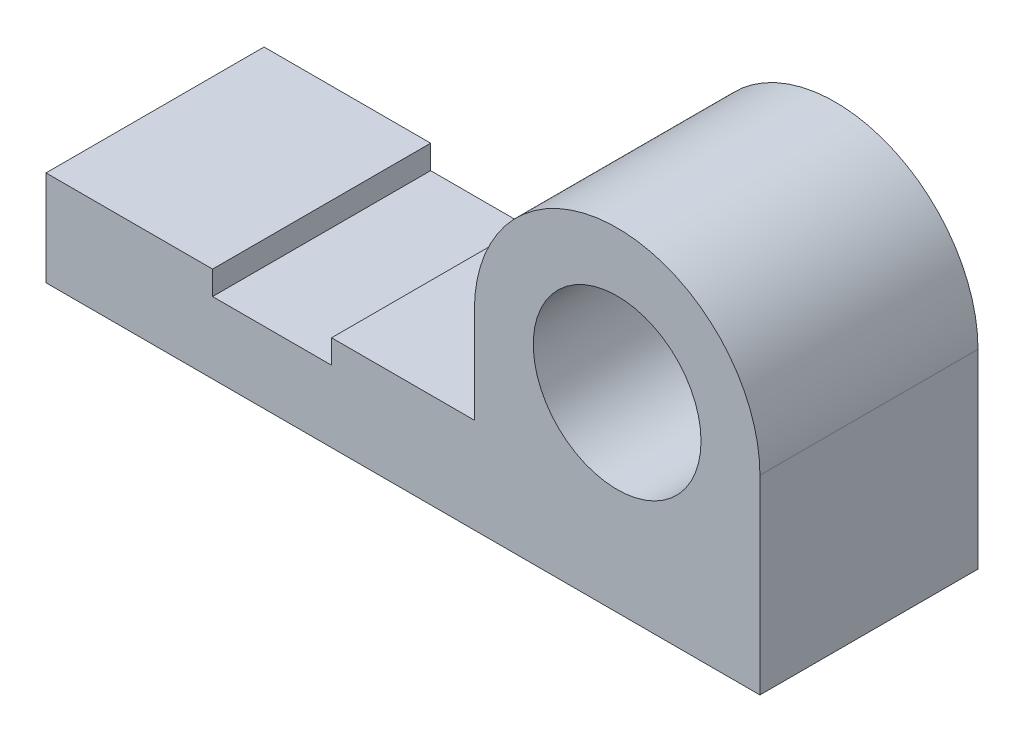
ISO-10303-21;
HEADER;
FILE_DESCRIPTION(('STEP AP214'),'2;1');
FILE_NAME('part.step','',(''),(''),'','','');
FILE_SCHEMA(('AUTOMOTIVE_DESIGN { 1 0 10303 214 1 1 1 1 }'));
ENDSEC;
DATA;
#1=APPLICATION_CONTEXT('core data for automotive mechanical design processes');
#2=APPLICATION_PROTOCOL_DEFINITION('international standard','automotive_design',2000,#1);
#3=PRODUCT_CONTEXT('',#1,'mechanical');
#4=PRODUCT('Part','Part','',(#3));
#5=PRODUCT_RELATED_PRODUCT_CATEGORY('part','',(#4));
#6=PRODUCT_DEFINITION_FORMATION('','',#4);
#7=PRODUCT_DEFINITION_CONTEXT('part definition',#1,'design');
#8=PRODUCT_DEFINITION('design','',#6,#7);
#9=PRODUCT_DEFINITION_SHAPE('','',#8);
#10=(LENGTH_UNIT() NAMED_UNIT(*) SI_UNIT(.MILLI.,.METRE.));
#11=(NAMED_UNIT(*) PLANE_ANGLE_UNIT() SI_UNIT($,.RADIAN.));
#12=(NAMED_UNIT(*) SI_UNIT($,.STERADIAN.) SOLID_ANGLE_UNIT());
#13=UNCERTAINTY_MEASURE_WITH_UNIT(LENGTH_MEASURE(1.E-05),#10,'distance_accuracy_value','');
#14=(GEOMETRIC_REPRESENTATION_CONTEXT(3) GLOBAL_UNCERTAINTY_ASSIGNED_CONTEXT((#13)) GLOBAL_UNIT_ASSIGNED_CONTEXT((#10,
#11,#12)) REPRESENTATION_CONTEXT('',''));
#15=CARTESIAN_POINT('',(0.,0.,0.));
#16=DIRECTION('',(0.,0.,1.));
#17=DIRECTION('',(1.,0.,0.));
#18=AXIS2_PLACEMENT_3D('',#15,#16,#17);
#19=CARTESIAN_POINT('',(-25.5375472920209,34.0500630560278,39.));
#20=DIRECTION('',(0.,0.,1.));
#21=DIRECTION('',(1.,0.,0.));
#22=AXIS2_PLACEMENT_3D('',#19,#20,#21);
#23=PLANE('',#22);
#24=DIRECTION('',(0.,1.,0.));
#25=VECTOR('',#24,1.);
#26=CARTESIAN_POINT('',(0.,0.,39.));
#27=LINE('',#26,#25);
#28=CARTESIAN_POINT('',(0.,0.,39.));
#29=VERTEX_POINT('',#28);
#30=CARTESIAN_POINT('',(0.,34.0500630560278,39.));
#31=VERTEX_POINT('',#30);
#32=EDGE_CURVE('E167',#29,#31,#27,.T.);
#33=ORIENTED_EDGE('',*,*,#32,.T.);
#34=CARTESIAN_POINT('',(-25.5375472920209,34.0500630560278,39.));
#35=DIRECTION('',(0.,0.,1.));
#36=DIRECTION('',(1.,0.,0.));
#37=AXIS2_PLACEMENT_3D('',#34,#35,#36);
#38=CIRCLE('',#37,25.5375472920209);
#39=CARTESIAN_POINT('',(-51.0750945840418,34.0500630560278,39.));
#40=VERTEX_POINT('',#39);
#41=EDGE_CURVE('E103',#31,#40,#38,.T.);
#42=ORIENTED_EDGE('',*,*,#41,.T.);
#43=DIRECTION('',(0.,-1.,0.));
#44=VECTOR('',#43,1.);
#45=CARTESIAN_POINT('',(-51.0750945840418,17.0250315280139,39.));
#46=LINE('',#45,#44);
#47=CARTESIAN_POINT('',(-51.0750945840418,17.0250315280139,39.));
#48=VERTEX_POINT('',#47);
#49=EDGE_CURVE('E187',#40,#48,#46,.T.);
#50=ORIENTED_EDGE('',*,*,#49,.T.);
#51=DIRECTION('',(-1.,0.,0.));
#52=VECTOR('',#51,1.);
#53=CARTESIAN_POINT('',(-76.6126418760627,17.0250315280139,39.));
#54=LINE('',#53,#52);
#55=CARTESIAN_POINT('',(-76.6126418760627,17.0250315280139,39.));
#56=VERTEX_POINT('',#55);
#57=EDGE_CURVE('E207',#48,#56,#54,.T.);
#58=ORIENTED_EDGE('',*,*,#57,.T.);
#59=DIRECTION('',(0.,-1.,0.));
#60=VECTOR('',#59,1.);
#61=CARTESIAN_POINT('',(-76.6126418760627,12.7687736460104,39.));
#62=LINE('',#61,#60);
#63=CARTESIAN_POINT('',(-76.6126418760627,12.7687736460104,39.));
#64=VERTEX_POINT('',#63);
#65=EDGE_CURVE('E204',#56,#64,#62,.T.);
#66=ORIENTED_EDGE('',*,*,#65,.T.);
#67=DIRECTION('',(-1.,0.,0.));
#68=VECTOR('',#67,1.);
#69=CARTESIAN_POINT('',(-97.8939312860801,12.7687736460104,39.));
#70=LINE('',#69,#68);
#71=CARTESIAN_POINT('',(-97.8939312860801,12.7687736460104,39.));
#72=VERTEX_POINT('',#71);
#73=EDGE_CURVE('E206',#64,#72,#70,.T.);
#74=ORIENTED_EDGE('',*,*,#73,.T.);
#75=DIRECTION('',(0.,1.,0.));
#76=VECTOR('',#75,1.);
#77=CARTESIAN_POINT('',(-97.8939312860801,17.0250315280139,39.));
#78=LINE('',#77,#76);
#79=CARTESIAN_POINT('',(-97.8939312860801,17.0250315280139,39.));
#80=VERTEX_POINT('',#79);
#81=EDGE_CURVE('E127',#72,#80,#78,.T.);
#82=ORIENTED_EDGE('',*,*,#81,.T.);
#83=DIRECTION('',(-1.,0.,0.));
#84=VECTOR('',#83,1.);
#85=CARTESIAN_POINT('',(-127.687736460104,17.0250315280139,39.));
#86=LINE('',#85,#84);
#87=CARTESIAN_POINT('',(-127.687736460104,17.0250315280139,39.));
#88=VERTEX_POINT('',#87);
#89=EDGE_CURVE('E125',#80,#88,#86,.T.);
#90=ORIENTED_EDGE('',*,*,#89,.T.);
#91=DIRECTION('',(0.,-1.,0.));
#92=VECTOR('',#91,1.);
#93=CARTESIAN_POINT('',(-127.687736460104,0.,39.));
#94=LINE('',#93,#92);
#95=CARTESIAN_POINT('',(-127.687736460104,0.,39.));
#96=VERTEX_POINT('',#95);
#97=EDGE_CURVE('E126',#88,#96,#94,.T.);
#98=ORIENTED_EDGE('',*,*,#97,.T.);
#99=DIRECTION('',(1.,0.,0.));
#100=VECTOR('',#99,1.);
#101=CARTESIAN_POINT('',(0.,0.,39.));
#102=LINE('',#101,#100);
#103=EDGE_CURVE('E57',#96,#29,#102,.T.);
#104=ORIENTED_EDGE('',*,*,#103,.T.);
#105=EDGE_LOOP('',(#33,#42,#50,#58,#66,#74,#82,#90,#98,#104));
#106=FACE_BOUND('',#105,.T.);
#107=CARTESIAN_POINT('',(-25.5375472920209,34.0500630560278,39.));
#108=DIRECTION('',(0.,0.,1.));
#109=DIRECTION('',(1.,0.,0.));
#110=AXIS2_PLACEMENT_3D('',#107,#108,#109);
#111=CIRCLE('',#110,15.);
#112=CARTESIAN_POINT('',(-10.5375472920209,34.0500630560278,39.));
#113=VERTEX_POINT('',#112);
#114=EDGE_CURVE('E152',#113,#113,#111,.T.);
#115=ORIENTED_EDGE('',*,*,#114,.F.);
#116=EDGE_LOOP('',(#115));
#117=FACE_BOUND('',#116,.T.);
#118=ADVANCED_FACE('F39',(#106,#117),#23,.T.);
#119=CARTESIAN_POINT('',(-25.5375472920209,34.0500630560278,0.));
#120=DIRECTION('',(0.,0.,1.));
#121=DIRECTION('',(1.,0.,0.));
#122=AXIS2_PLACEMENT_3D('',#119,#120,#121);
#123=PLANE('',#122);
#124=DIRECTION('',(0.,1.,0.));
#125=VECTOR('',#124,1.);
#126=CARTESIAN_POINT('',(0.,0.,0.));
#127=LINE('',#126,#125);
#128=CARTESIAN_POINT('',(0.,0.,0.));
#129=VERTEX_POINT('',#128);
#130=CARTESIAN_POINT('',(0.,34.0500630560278,0.));
#131=VERTEX_POINT('',#130);
#132=EDGE_CURVE('E149',#129,#131,#127,.T.);
#133=ORIENTED_EDGE('',*,*,#132,.F.);
#134=DIRECTION('',(1.,0.,0.));
#135=VECTOR('',#134,1.);
#136=CARTESIAN_POINT('',(0.,0.,0.));
#137=LINE('',#136,#135);
#138=CARTESIAN_POINT('',(-127.687736460104,0.,0.));
#139=VERTEX_POINT('',#138);
#140=EDGE_CURVE('E100',#139,#129,#137,.T.);
#141=ORIENTED_EDGE('',*,*,#140,.F.);
#142=DIRECTION('',(0.,-1.,0.));
#143=VECTOR('',#142,1.);
#144=CARTESIAN_POINT('',(-127.687736460104,0.,0.));
#145=LINE('',#144,#143);
#146=CARTESIAN_POINT('',(-127.687736460104,17.0250315280139,0.));
#147=VERTEX_POINT('',#146);
#148=EDGE_CURVE('E91',#147,#139,#145,.T.);
#149=ORIENTED_EDGE('',*,*,#148,.F.);
#150=DIRECTION('',(-1.,0.,0.));
#151=VECTOR('',#150,1.);
#152=CARTESIAN_POINT('',(-127.687736460104,17.0250315280139,0.));
#153=LINE('',#152,#151);
#154=CARTESIAN_POINT('',(-97.8939312860801,17.0250315280139,0.));
#155=VERTEX_POINT('',#154);
#156=EDGE_CURVE('E138',#155,#147,#153,.T.);
#157=ORIENTED_EDGE('',*,*,#156,.F.);
#158=DIRECTION('',(0.,1.,0.));
#159=VECTOR('',#158,1.);
#160=CARTESIAN_POINT('',(-97.8939312860801,17.0250315280139,0.));
#161=LINE('',#160,#159);
#162=CARTESIAN_POINT('',(-97.8939312860801,12.7687736460104,0.));
#163=VERTEX_POINT('',#162);
#164=EDGE_CURVE('E162',#163,#155,#161,.T.);
#165=ORIENTED_EDGE('',*,*,#164,.F.);
#166=DIRECTION('',(-1.,0.,0.));
#167=VECTOR('',#166,1.);
#168=CARTESIAN_POINT('',(-97.8939312860801,12.7687736460104,0.));
#169=LINE('',#168,#167);
#170=CARTESIAN_POINT('',(-76.6126418760627,12.7687736460104,0.));
#171=VERTEX_POINT('',#170);
#172=EDGE_CURVE('E158',#171,#163,#169,.T.);
#173=ORIENTED_EDGE('',*,*,#172,.F.);
#174=DIRECTION('',(0.,-1.,0.));
#175=VECTOR('',#174,1.);
#176=CARTESIAN_POINT('',(-76.6126418760627,12.7687736460104,0.));
#177=LINE('',#176,#175);
#178=CARTESIAN_POINT('',(-76.6126418760627,17.0250315280139,0.));
#179=VERTEX_POINT('',#178);
#180=EDGE_CURVE('E156',#179,#171,#177,.T.);
#181=ORIENTED_EDGE('',*,*,#180,.F.);
#182=DIRECTION('',(-1.,0.,0.));
#183=VECTOR('',#182,1.);
#184=CARTESIAN_POINT('',(-76.6126418760627,17.0250315280139,0.));
#185=LINE('',#184,#183);
#186=CARTESIAN_POINT('',(-51.0750945840418,17.0250315280139,0.));
#187=VERTEX_POINT('',#186);
#188=EDGE_CURVE('E157',#187,#179,#185,.T.);
#189=ORIENTED_EDGE('',*,*,#188,.F.);
#190=DIRECTION('',(0.,-1.,0.));
#191=VECTOR('',#190,1.);
#192=CARTESIAN_POINT('',(-51.0750945840418,17.0250315280139,0.));
#193=LINE('',#192,#191);
#194=CARTESIAN_POINT('',(-51.0750945840418,34.0500630560278,0.));
#195=VERTEX_POINT('',#194);
#196=EDGE_CURVE('E153',#195,#187,#193,.T.);
#197=ORIENTED_EDGE('',*,*,#196,.F.);
#198=CARTESIAN_POINT('',(-25.5375472920209,34.0500630560278,0.));
#199=DIRECTION('',(0.,0.,1.));
#200=DIRECTION('',(1.,0.,0.));
#201=AXIS2_PLACEMENT_3D('',#198,#199,#200);
#202=CIRCLE('',#201,25.5375472920209);
#203=EDGE_CURVE('E151',#131,#195,#202,.T.);
#204=ORIENTED_EDGE('',*,*,#203,.F.);
#205=EDGE_LOOP('',(#133,#141,#149,#157,#165,#173,#181,#189,#197,#204));
#206=FACE_BOUND('',#205,.T.);
#207=CARTESIAN_POINT('',(-25.5375472920209,34.0500630560278,0.));
#208=DIRECTION('',(0.,0.,1.));
#209=DIRECTION('',(1.,0.,0.));
#210=AXIS2_PLACEMENT_3D('',#207,#208,#209);
#211=CIRCLE('',#210,15.);
#212=CARTESIAN_POINT('',(-10.5375472920209,34.0500630560278,0.));
#213=VERTEX_POINT('',#212);
#214=EDGE_CURVE('E214',#213,#213,#211,.T.);
#215=ORIENTED_EDGE('',*,*,#214,.T.);
#216=EDGE_LOOP('',(#215));
#217=FACE_BOUND('',#216,.T.);
#218=ADVANCED_FACE('F195',(#206,#217),#123,.F.);
#219=CARTESIAN_POINT('',(0.,0.,39.));
#220=DIRECTION('',(-1.,0.,0.));
#221=DIRECTION('',(0.,0.,1.));
#222=AXIS2_PLACEMENT_3D('',#219,#220,#221);
#223=PLANE('',#222);
#224=ORIENTED_EDGE('',*,*,#132,.T.);
#225=DIRECTION('',(0.,0.,-1.));
#226=VECTOR('',#225,1.);
#227=CARTESIAN_POINT('',(0.,34.0500630560278,39.));
#228=LINE('',#227,#226);
#229=EDGE_CURVE('E11',#31,#131,#228,.T.);
#230=ORIENTED_EDGE('',*,*,#229,.F.);
#231=ORIENTED_EDGE('',*,*,#32,.F.);
#232=DIRECTION('',(0.,0.,-1.));
#233=VECTOR('',#232,1.);
#234=CARTESIAN_POINT('',(0.,0.,39.));
#235=LINE('',#234,#233);
#236=EDGE_CURVE('E143',#29,#129,#235,.T.);
#237=ORIENTED_EDGE('',*,*,#236,.T.);
#238=EDGE_LOOP('',(#224,#230,#231,#237));
#239=FACE_BOUND('',#238,.T.);
#240=ADVANCED_FACE('F41',(#239),#223,.F.);
#241=CARTESIAN_POINT('',(-25.5375472920209,34.0500630560278,39.));
#242=DIRECTION('',(0.,0.,-1.));
#243=DIRECTION('',(-1.,0.,0.));
#244=AXIS2_PLACEMENT_3D('',#241,#242,#243);
#245=CYLINDRICAL_SURFACE('',#244,25.5375472920209);
#246=ORIENTED_EDGE('',*,*,#203,.T.);
#247=DIRECTION('',(0.,0.,-1.));
#248=VECTOR('',#247,1.);
#249=CARTESIAN_POINT('',(-51.0750945840418,34.0500630560278,39.));
#250=LINE('',#249,#248);
#251=EDGE_CURVE('E48',#40,#195,#250,.T.);
#252=ORIENTED_EDGE('',*,*,#251,.F.);
#253=ORIENTED_EDGE('',*,*,#41,.F.);
#254=ORIENTED_EDGE('',*,*,#229,.T.);
#255=EDGE_LOOP('',(#246,#252,#253,#254));
#256=FACE_BOUND('',#255,.T.);
#257=ADVANCED_FACE('F251',(#256),#245,.T.);
#258=CARTESIAN_POINT('',(-51.0750945840418,17.0250315280139,39.));
#259=DIRECTION('',(1.,0.,0.));
#260=DIRECTION('',(0.,0.,-1.));
#261=AXIS2_PLACEMENT_3D('',#258,#259,#260);
#262=PLANE('',#261);
#263=ORIENTED_EDGE('',*,*,#196,.T.);
#264=DIRECTION('',(0.,0.,-1.));
#265=VECTOR('',#264,1.);
#266=CARTESIAN_POINT('',(-51.0750945840418,17.0250315280139,39.));
#267=LINE('',#266,#265);
#268=EDGE_CURVE('E179',#48,#187,#267,.T.);
#269=ORIENTED_EDGE('',*,*,#268,.F.);
#270=ORIENTED_EDGE('',*,*,#49,.F.);
#271=ORIENTED_EDGE('',*,*,#251,.T.);
#272=EDGE_LOOP('',(#263,#269,#270,#271));
#273=FACE_BOUND('',#272,.T.);
#274=ADVANCED_FACE('F186',(#273),#262,.F.);
#275=CARTESIAN_POINT('',(-76.6126418760627,17.0250315280139,39.));
#276=DIRECTION('',(0.,-1.,0.));
#277=DIRECTION('',(0.,0.,-1.));
#278=AXIS2_PLACEMENT_3D('',#275,#276,#277);
#279=PLANE('',#278);
#280=ORIENTED_EDGE('',*,*,#188,.T.);
#281=DIRECTION('',(0.,0.,-1.));
#282=VECTOR('',#281,1.);
#283=CARTESIAN_POINT('',(-76.6126418760627,17.0250315280139,39.));
#284=LINE('',#283,#282);
#285=EDGE_CURVE('E180',#56,#179,#284,.T.);
#286=ORIENTED_EDGE('',*,*,#285,.F.);
#287=ORIENTED_EDGE('',*,*,#57,.F.);
#288=ORIENTED_EDGE('',*,*,#268,.T.);
#289=EDGE_LOOP('',(#280,#286,#287,#288));
#290=FACE_BOUND('',#289,.T.);
#291=ADVANCED_FACE('F199',(#290),#279,.F.);
#292=CARTESIAN_POINT('',(-76.6126418760627,12.7687736460104,39.));
#293=DIRECTION('',(1.,0.,0.));
#294=DIRECTION('',(0.,0.,-1.));
#295=AXIS2_PLACEMENT_3D('',#292,#293,#294);
#296=PLANE('',#295);
#297=ORIENTED_EDGE('',*,*,#180,.T.);
#298=DIRECTION('',(0.,0.,-1.));
#299=VECTOR('',#298,1.);
#300=CARTESIAN_POINT('',(-76.6126418760627,12.7687736460104,39.));
#301=LINE('',#300,#299);
#302=EDGE_CURVE('E174',#64,#171,#301,.T.);
#303=ORIENTED_EDGE('',*,*,#302,.F.);
#304=ORIENTED_EDGE('',*,*,#65,.F.);
#305=ORIENTED_EDGE('',*,*,#285,.T.);
#306=EDGE_LOOP('',(#297,#303,#304,#305));
#307=FACE_BOUND('',#306,.T.);
#308=ADVANCED_FACE('F205',(#307),#296,.F.);
#309=CARTESIAN_POINT('',(-97.8939312860801,12.7687736460104,39.));
#310=DIRECTION('',(0.,-1.,0.));
#311=DIRECTION('',(0.,0.,-1.));
#312=AXIS2_PLACEMENT_3D('',#309,#310,#311);
#313=PLANE('',#312);
#314=ORIENTED_EDGE('',*,*,#172,.T.);
#315=DIRECTION('',(0.,0.,-1.));
#316=VECTOR('',#315,1.);
#317=CARTESIAN_POINT('',(-97.8939312860801,12.7687736460104,39.));
#318=LINE('',#317,#316);
#319=EDGE_CURVE('E173',#72,#163,#318,.T.);
#320=ORIENTED_EDGE('',*,*,#319,.F.);
#321=ORIENTED_EDGE('',*,*,#73,.F.);
#322=ORIENTED_EDGE('',*,*,#302,.T.);
#323=EDGE_LOOP('',(#314,#320,#321,#322));
#324=FACE_BOUND('',#323,.T.);
#325=ADVANCED_FACE('F241',(#324),#313,.F.);
#326=CARTESIAN_POINT('',(-97.8939312860801,17.0250315280139,39.));
#327=DIRECTION('',(-1.,0.,0.));
#328=DIRECTION('',(0.,0.,1.));
#329=AXIS2_PLACEMENT_3D('',#326,#327,#328);
#330=PLANE('',#329);
#331=ORIENTED_EDGE('',*,*,#164,.T.);
#332=DIRECTION('',(0.,0.,-1.));
#333=VECTOR('',#332,1.);
#334=CARTESIAN_POINT('',(-97.8939312860801,17.0250315280139,39.));
#335=LINE('',#334,#333);
#336=EDGE_CURVE('E137',#80,#155,#335,.T.);
#337=ORIENTED_EDGE('',*,*,#336,.F.);
#338=ORIENTED_EDGE('',*,*,#81,.F.);
#339=ORIENTED_EDGE('',*,*,#319,.T.);
#340=EDGE_LOOP('',(#331,#337,#338,#339));
#341=FACE_BOUND('',#340,.T.);
#342=ADVANCED_FACE('F239',(#341),#330,.F.);
#343=CARTESIAN_POINT('',(-127.687736460104,17.0250315280139,39.));
#344=DIRECTION('',(0.,-1.,0.));
#345=DIRECTION('',(0.,0.,-1.));
#346=AXIS2_PLACEMENT_3D('',#343,#344,#345);
#347=PLANE('',#346);
#348=ORIENTED_EDGE('',*,*,#156,.T.);
#349=DIRECTION('',(0.,0.,-1.));
#350=VECTOR('',#349,1.);
#351=CARTESIAN_POINT('',(-127.687736460104,17.0250315280139,39.));
#352=LINE('',#351,#350);
#353=EDGE_CURVE('E134',#88,#147,#352,.T.);
#354=ORIENTED_EDGE('',*,*,#353,.F.);
#355=ORIENTED_EDGE('',*,*,#89,.F.);
#356=ORIENTED_EDGE('',*,*,#336,.T.);
#357=EDGE_LOOP('',(#348,#354,#355,#356));
#358=FACE_BOUND('',#357,.T.);
#359=ADVANCED_FACE('F136',(#358),#347,.F.);
#360=CARTESIAN_POINT('',(-127.687736460104,0.,39.));
#361=DIRECTION('',(1.,0.,0.));
#362=DIRECTION('',(0.,0.,-1.));
#363=AXIS2_PLACEMENT_3D('',#360,#361,#362);
#364=PLANE('',#363);
#365=ORIENTED_EDGE('',*,*,#148,.T.);
#366=DIRECTION('',(0.,0.,-1.));
#367=VECTOR('',#366,1.);
#368=CARTESIAN_POINT('',(-127.687736460104,0.,39.));
#369=LINE('',#368,#367);
#370=EDGE_CURVE('E139',#96,#139,#369,.T.);
#371=ORIENTED_EDGE('',*,*,#370,.F.);
#372=ORIENTED_EDGE('',*,*,#97,.F.);
#373=ORIENTED_EDGE('',*,*,#353,.T.);
#374=EDGE_LOOP('',(#365,#371,#372,#373));
#375=FACE_BOUND('',#374,.T.);
#376=ADVANCED_FACE('F145',(#375),#364,.F.);
#377=CARTESIAN_POINT('',(0.,0.,39.));
#378=DIRECTION('',(0.,1.,0.));
#379=DIRECTION('',(-1.,0.,0.));
#380=AXIS2_PLACEMENT_3D('',#377,#378,#379);
#381=PLANE('',#380);
#382=ORIENTED_EDGE('',*,*,#140,.T.);
#383=ORIENTED_EDGE('',*,*,#236,.F.);
#384=ORIENTED_EDGE('',*,*,#103,.F.);
#385=ORIENTED_EDGE('',*,*,#370,.T.);
#386=EDGE_LOOP('',(#382,#383,#384,#385));
#387=FACE_BOUND('',#386,.T.);
#388=ADVANCED_FACE('F231',(#387),#381,.F.);
#389=CARTESIAN_POINT('',(-25.5375472920209,34.0500630560278,39.));
#390=DIRECTION('',(0.,0.,-1.));
#391=DIRECTION('',(-1.,0.,0.));
#392=AXIS2_PLACEMENT_3D('',#389,#390,#391);
#393=CYLINDRICAL_SURFACE('',#392,15.);
#394=ORIENTED_EDGE('',*,*,#114,.T.);
#395=EDGE_LOOP('',(#394));
#396=FACE_BOUND('',#395,.T.);
#397=ORIENTED_EDGE('',*,*,#214,.F.);
#398=EDGE_LOOP('',(#397));
#399=FACE_BOUND('',#398,.T.);
#400=ADVANCED_FACE('F221',(#396,#399),#393,.F.);
#401=CLOSED_SHELL('',(#118,#218,#240,#257,#274,#291,#308,#325,#342,#359,#376,#388,#400));
#402=MANIFOLD_SOLID_BREP('B2',#401);
#403=ADVANCED_BREP_SHAPE_REPRESENTATION('',(#18,#402),#14);
#404=SHAPE_DEFINITION_REPRESENTATION(#9,#403);
ENDSEC;
END-ISO-10303-21;
